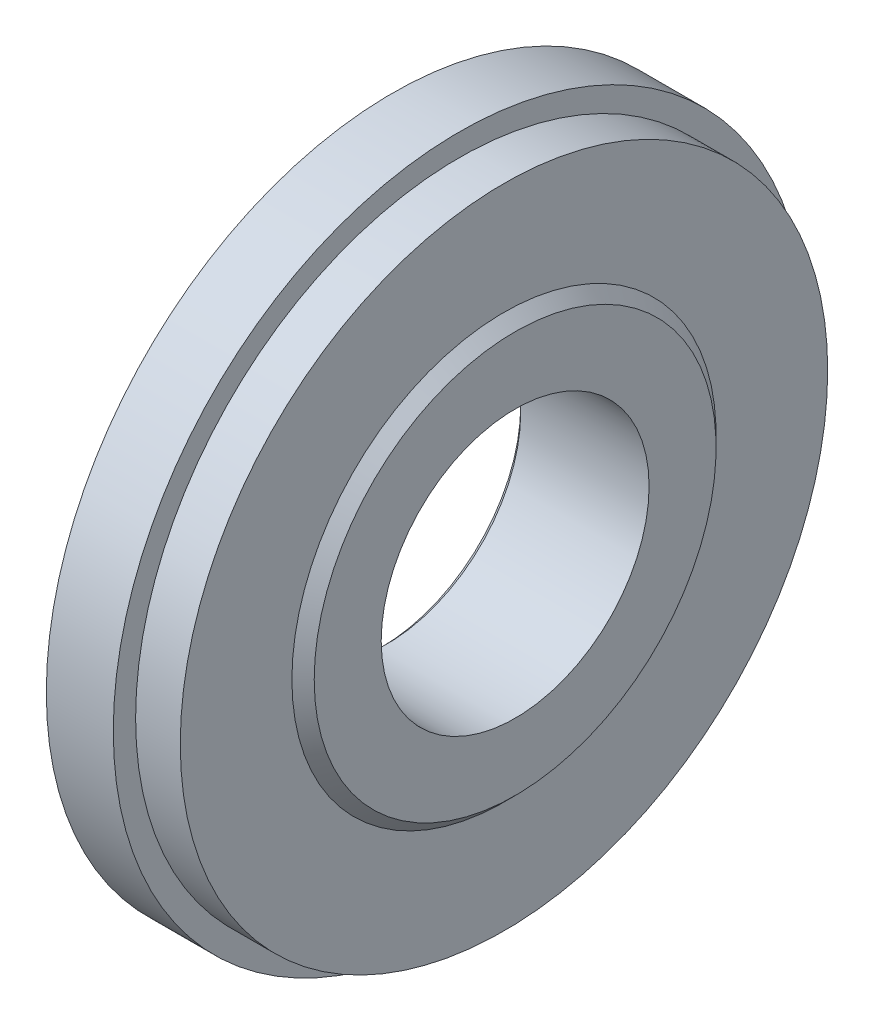
ISO-10303-21;
HEADER;
FILE_DESCRIPTION(('STEP AP214'),'2;1');
FILE_NAME('part.step','',(''),(''),'','','');
FILE_SCHEMA(('AUTOMOTIVE_DESIGN { 1 0 10303 214 1 1 1 1 }'));
ENDSEC;
DATA;
#1=APPLICATION_CONTEXT('core data for automotive mechanical design processes');
#2=APPLICATION_PROTOCOL_DEFINITION('international standard','automotive_design',2000,#1);
#3=PRODUCT_CONTEXT('',#1,'mechanical');
#4=PRODUCT('Part','Part','',(#3));
#5=PRODUCT_RELATED_PRODUCT_CATEGORY('part','',(#4));
#6=PRODUCT_DEFINITION_FORMATION('','',#4);
#7=PRODUCT_DEFINITION_CONTEXT('part definition',#1,'design');
#8=PRODUCT_DEFINITION('design','',#6,#7);
#9=PRODUCT_DEFINITION_SHAPE('','',#8);
#10=(LENGTH_UNIT() NAMED_UNIT(*) SI_UNIT(.MILLI.,.METRE.));
#11=(NAMED_UNIT(*) PLANE_ANGLE_UNIT() SI_UNIT($,.RADIAN.));
#12=(NAMED_UNIT(*) SI_UNIT($,.STERADIAN.) SOLID_ANGLE_UNIT());
#13=UNCERTAINTY_MEASURE_WITH_UNIT(LENGTH_MEASURE(1.E-05),#10,'distance_accuracy_value','');
#14=(GEOMETRIC_REPRESENTATION_CONTEXT(3) GLOBAL_UNCERTAINTY_ASSIGNED_CONTEXT((#13)) GLOBAL_UNIT_ASSIGNED_CONTEXT((#10,
#11,#12)) REPRESENTATION_CONTEXT('',''));
#15=CARTESIAN_POINT('',(0.,0.,0.));
#16=DIRECTION('',(0.,0.,1.));
#17=DIRECTION('',(1.,0.,0.));
#18=AXIS2_PLACEMENT_3D('',#15,#16,#17);
#19=CARTESIAN_POINT('',(-8.00000000000001,0.,0.));
#20=DIRECTION('',(-1.,0.,0.));
#21=DIRECTION('',(0.,0.,1.));
#22=AXIS2_PLACEMENT_3D('',#19,#20,#21);
#23=CYLINDRICAL_SURFACE('',#22,16.);
#24=CARTESIAN_POINT('',(0.500000000000004,0.,0.));
#25=DIRECTION('',(-1.,0.,0.));
#26=DIRECTION('',(0.,0.,1.));
#27=AXIS2_PLACEMENT_3D('',#24,#25,#26);
#28=CIRCLE('',#27,16.);
#29=CARTESIAN_POINT('',(0.500000000000004,0.,16.));
#30=VERTEX_POINT('',#29);
#31=EDGE_CURVE('E10',#30,#30,#28,.F.);
#32=ORIENTED_EDGE('',*,*,#31,.T.);
#33=EDGE_LOOP('',(#32));
#34=FACE_BOUND('',#33,.T.);
#35=CARTESIAN_POINT('',(5.00000000000001,0.,0.));
#36=DIRECTION('',(-1.,0.,0.));
#37=DIRECTION('',(0.,0.,1.));
#38=AXIS2_PLACEMENT_3D('',#35,#36,#37);
#39=CIRCLE('',#38,16.);
#40=CARTESIAN_POINT('',(5.00000000000001,0.,16.));
#41=VERTEX_POINT('',#40);
#42=EDGE_CURVE('E51',#41,#41,#39,.T.);
#43=ORIENTED_EDGE('',*,*,#42,.T.);
#44=EDGE_LOOP('',(#43));
#45=FACE_BOUND('',#44,.T.);
#46=ADVANCED_FACE('F32',(#34,#45),#23,.T.);
#47=CARTESIAN_POINT('',(5.00000000000001,0.,0.));
#48=DIRECTION('',(-1.,0.,0.));
#49=DIRECTION('',(0.,0.,1.));
#50=AXIS2_PLACEMENT_3D('',#47,#48,#49);
#51=TOROIDAL_SURFACE('',#50,18.,2.);
#52=ORIENTED_EDGE('',*,*,#42,.F.);
#53=EDGE_LOOP('',(#52));
#54=FACE_BOUND('',#53,.T.);
#55=CARTESIAN_POINT('',(7.00000000000001,0.,0.));
#56=DIRECTION('',(-1.,0.,0.));
#57=DIRECTION('',(0.,0.,1.));
#58=AXIS2_PLACEMENT_3D('',#55,#56,#57);
#59=CIRCLE('',#58,18.);
#60=CARTESIAN_POINT('',(7.00000000000001,0.,18.));
#61=VERTEX_POINT('',#60);
#62=EDGE_CURVE('E54',#61,#61,#59,.T.);
#63=ORIENTED_EDGE('',*,*,#62,.T.);
#64=EDGE_LOOP('',(#63));
#65=FACE_BOUND('',#64,.T.);
#66=ADVANCED_FACE('F105',(#54,#65),#51,.F.);
#67=CARTESIAN_POINT('',(7.00000000000001,18.,0.));
#68=DIRECTION('',(-1.,0.,0.));
#69=DIRECTION('',(0.,0.,1.));
#70=AXIS2_PLACEMENT_3D('',#67,#68,#69);
#71=PLANE('',#70);
#72=CARTESIAN_POINT('',(7.00000000000001,0.,0.));
#73=DIRECTION('',(-1.,0.,0.));
#74=DIRECTION('',(0.,0.,1.));
#75=AXIS2_PLACEMENT_3D('',#72,#73,#74);
#76=CIRCLE('',#75,26.);
#77=CARTESIAN_POINT('',(7.00000000000001,0.,26.));
#78=VERTEX_POINT('',#77);
#79=EDGE_CURVE('E57',#78,#78,#76,.T.);
#80=ORIENTED_EDGE('',*,*,#79,.T.);
#81=EDGE_LOOP('',(#80));
#82=FACE_BOUND('',#81,.T.);
#83=ORIENTED_EDGE('',*,*,#62,.F.);
#84=EDGE_LOOP('',(#83));
#85=FACE_BOUND('',#84,.T.);
#86=ADVANCED_FACE('F109',(#82,#85),#71,.T.);
#87=CARTESIAN_POINT('',(5.00000000000001,0.,0.));
#88=DIRECTION('',(-1.,0.,0.));
#89=DIRECTION('',(0.,0.,1.));
#90=AXIS2_PLACEMENT_3D('',#87,#88,#89);
#91=TOROIDAL_SURFACE('',#90,26.,2.);
#92=ORIENTED_EDGE('',*,*,#79,.F.);
#93=EDGE_LOOP('',(#92));
#94=FACE_BOUND('',#93,.T.);
#95=CARTESIAN_POINT('',(5.00000000000001,0.,0.));
#96=DIRECTION('',(-1.,0.,0.));
#97=DIRECTION('',(0.,0.,1.));
#98=AXIS2_PLACEMENT_3D('',#95,#96,#97);
#99=CIRCLE('',#98,28.);
#100=CARTESIAN_POINT('',(5.00000000000001,0.,28.));
#101=VERTEX_POINT('',#100);
#102=EDGE_CURVE('E60',#101,#101,#99,.T.);
#103=ORIENTED_EDGE('',*,*,#102,.T.);
#104=EDGE_LOOP('',(#103));
#105=FACE_BOUND('',#104,.T.);
#106=ADVANCED_FACE('F117',(#94,#105),#91,.F.);
#107=CARTESIAN_POINT('',(-8.00000000000001,0.,0.));
#108=DIRECTION('',(-1.,0.,0.));
#109=DIRECTION('',(0.,0.,1.));
#110=AXIS2_PLACEMENT_3D('',#107,#108,#109);
#111=CYLINDRICAL_SURFACE('',#110,28.);
#112=CARTESIAN_POINT('',(1.,0.,0.));
#113=DIRECTION('',(-1.,0.,0.));
#114=DIRECTION('',(0.,0.,1.));
#115=AXIS2_PLACEMENT_3D('',#112,#113,#114);
#116=CIRCLE('',#115,28.);
#117=CARTESIAN_POINT('',(1.,0.,28.));
#118=VERTEX_POINT('',#117);
#119=EDGE_CURVE('E63',#118,#118,#116,.T.);
#120=ORIENTED_EDGE('',*,*,#119,.T.);
#121=EDGE_LOOP('',(#120));
#122=FACE_BOUND('',#121,.T.);
#123=ORIENTED_EDGE('',*,*,#102,.F.);
#124=EDGE_LOOP('',(#123));
#125=FACE_BOUND('',#124,.T.);
#126=ADVANCED_FACE('F123',(#122,#125),#111,.F.);
#127=CARTESIAN_POINT('',(1.,28.,0.));
#128=DIRECTION('',(-1.,0.,0.));
#129=DIRECTION('',(0.,0.,1.));
#130=AXIS2_PLACEMENT_3D('',#127,#128,#129);
#131=PLANE('',#130);
#132=CARTESIAN_POINT('',(1.,0.,0.));
#133=DIRECTION('',(-1.,0.,0.));
#134=DIRECTION('',(0.,0.,1.));
#135=AXIS2_PLACEMENT_3D('',#132,#133,#134);
#136=CIRCLE('',#135,31.);
#137=CARTESIAN_POINT('',(1.,0.,31.));
#138=VERTEX_POINT('',#137);
#139=EDGE_CURVE('E66',#138,#138,#136,.T.);
#140=ORIENTED_EDGE('',*,*,#139,.T.);
#141=EDGE_LOOP('',(#140));
#142=FACE_BOUND('',#141,.T.);
#143=ORIENTED_EDGE('',*,*,#119,.F.);
#144=EDGE_LOOP('',(#143));
#145=FACE_BOUND('',#144,.T.);
#146=ADVANCED_FACE('F129',(#142,#145),#131,.T.);
#147=CARTESIAN_POINT('',(-8.00000000000001,0.,0.));
#148=DIRECTION('',(-1.,0.,0.));
#149=DIRECTION('',(0.,0.,1.));
#150=AXIS2_PLACEMENT_3D('',#147,#148,#149);
#151=CYLINDRICAL_SURFACE('',#150,31.);
#152=CARTESIAN_POINT('',(7.,0.,0.));
#153=DIRECTION('',(-1.,0.,0.));
#154=DIRECTION('',(0.,0.,1.));
#155=AXIS2_PLACEMENT_3D('',#152,#153,#154);
#156=CIRCLE('',#155,31.);
#157=CARTESIAN_POINT('',(7.,0.,31.));
#158=VERTEX_POINT('',#157);
#159=EDGE_CURVE('E69',#158,#158,#156,.T.);
#160=ORIENTED_EDGE('',*,*,#159,.T.);
#161=EDGE_LOOP('',(#160));
#162=FACE_BOUND('',#161,.T.);
#163=ORIENTED_EDGE('',*,*,#139,.F.);
#164=EDGE_LOOP('',(#163));
#165=FACE_BOUND('',#164,.T.);
#166=ADVANCED_FACE('F133',(#162,#165),#151,.T.);
#167=CARTESIAN_POINT('',(7.,31.,0.));
#168=DIRECTION('',(1.,0.,0.));
#169=DIRECTION('',(0.,0.,-1.));
#170=AXIS2_PLACEMENT_3D('',#167,#168,#169);
#171=PLANE('',#170);
#172=CARTESIAN_POINT('',(7.,0.,0.));
#173=DIRECTION('',(-1.,0.,0.));
#174=DIRECTION('',(0.,0.,1.));
#175=AXIS2_PLACEMENT_3D('',#172,#173,#174);
#176=CIRCLE('',#175,29.);
#177=CARTESIAN_POINT('',(7.,0.,29.));
#178=VERTEX_POINT('',#177);
#179=EDGE_CURVE('E72',#178,#178,#176,.T.);
#180=ORIENTED_EDGE('',*,*,#179,.T.);
#181=EDGE_LOOP('',(#180));
#182=FACE_BOUND('',#181,.T.);
#183=ORIENTED_EDGE('',*,*,#159,.F.);
#184=EDGE_LOOP('',(#183));
#185=FACE_BOUND('',#184,.T.);
#186=ADVANCED_FACE('F137',(#182,#185),#171,.T.);
#187=CARTESIAN_POINT('',(-8.00000000000001,0.,0.));
#188=DIRECTION('',(-1.,0.,0.));
#189=DIRECTION('',(0.,0.,1.));
#190=AXIS2_PLACEMENT_3D('',#187,#188,#189);
#191=CYLINDRICAL_SURFACE('',#190,29.);
#192=CARTESIAN_POINT('',(11.,0.,0.));
#193=DIRECTION('',(-1.,0.,0.));
#194=DIRECTION('',(0.,0.,1.));
#195=AXIS2_PLACEMENT_3D('',#192,#193,#194);
#196=CIRCLE('',#195,29.);
#197=CARTESIAN_POINT('',(11.,0.,29.));
#198=VERTEX_POINT('',#197);
#199=EDGE_CURVE('E75',#198,#198,#196,.T.);
#200=ORIENTED_EDGE('',*,*,#199,.T.);
#201=EDGE_LOOP('',(#200));
#202=FACE_BOUND('',#201,.T.);
#203=ORIENTED_EDGE('',*,*,#179,.F.);
#204=EDGE_LOOP('',(#203));
#205=FACE_BOUND('',#204,.T.);
#206=ADVANCED_FACE('F141',(#202,#205),#191,.T.);
#207=CARTESIAN_POINT('',(11.,29.,0.));
#208=DIRECTION('',(1.,0.,0.));
#209=DIRECTION('',(0.,0.,-1.));
#210=AXIS2_PLACEMENT_3D('',#207,#208,#209);
#211=PLANE('',#210);
#212=CARTESIAN_POINT('',(11.,0.,0.));
#213=DIRECTION('',(-1.,0.,0.));
#214=DIRECTION('',(0.,0.,1.));
#215=AXIS2_PLACEMENT_3D('',#212,#213,#214);
#216=CIRCLE('',#215,19.0000000000001);
#217=CARTESIAN_POINT('',(11.,0.,19.0000000000001));
#218=VERTEX_POINT('',#217);
#219=EDGE_CURVE('E78',#218,#218,#216,.T.);
#220=ORIENTED_EDGE('',*,*,#219,.T.);
#221=EDGE_LOOP('',(#220));
#222=FACE_BOUND('',#221,.T.);
#223=ORIENTED_EDGE('',*,*,#199,.F.);
#224=EDGE_LOOP('',(#223));
#225=FACE_BOUND('',#224,.T.);
#226=ADVANCED_FACE('F145',(#222,#225),#211,.T.);
#227=CARTESIAN_POINT('',(11.,0.,0.));
#228=DIRECTION('',(-1.,0.,0.));
#229=DIRECTION('',(0.,0.,1.));
#230=AXIS2_PLACEMENT_3D('',#227,#228,#229);
#231=CONICAL_SURFACE('',#230,19.0000000000001,0.785398163397488);
#232=CARTESIAN_POINT('',(12.,0.,0.));
#233=DIRECTION('',(-1.,0.,0.));
#234=DIRECTION('',(0.,0.,1.));
#235=AXIS2_PLACEMENT_3D('',#232,#233,#234);
#236=CIRCLE('',#235,18.0000000000001);
#237=CARTESIAN_POINT('',(12.,0.,18.0000000000001));
#238=VERTEX_POINT('',#237);
#239=EDGE_CURVE('E81',#238,#238,#236,.T.);
#240=ORIENTED_EDGE('',*,*,#239,.T.);
#241=EDGE_LOOP('',(#240));
#242=FACE_BOUND('',#241,.T.);
#243=ORIENTED_EDGE('',*,*,#219,.F.);
#244=EDGE_LOOP('',(#243));
#245=FACE_BOUND('',#244,.T.);
#246=ADVANCED_FACE('F102',(#242,#245),#231,.T.);
#247=CARTESIAN_POINT('',(12.,18.0000000000001,0.));
#248=DIRECTION('',(1.,0.,0.));
#249=DIRECTION('',(0.,0.,-1.));
#250=AXIS2_PLACEMENT_3D('',#247,#248,#249);
#251=PLANE('',#250);
#252=CARTESIAN_POINT('',(12.,0.,0.));
#253=DIRECTION('',(-1.,0.,0.));
#254=DIRECTION('',(0.,0.,1.));
#255=AXIS2_PLACEMENT_3D('',#252,#253,#254);
#256=CIRCLE('',#255,12.);
#257=CARTESIAN_POINT('',(12.,0.,12.));
#258=VERTEX_POINT('',#257);
#259=EDGE_CURVE('E84',#258,#258,#256,.T.);
#260=ORIENTED_EDGE('',*,*,#259,.T.);
#261=EDGE_LOOP('',(#260));
#262=FACE_BOUND('',#261,.T.);
#263=ORIENTED_EDGE('',*,*,#239,.F.);
#264=EDGE_LOOP('',(#263));
#265=FACE_BOUND('',#264,.T.);
#266=ADVANCED_FACE('F88',(#262,#265),#251,.T.);
#267=CARTESIAN_POINT('',(-8.00000000000001,0.,0.));
#268=DIRECTION('',(-1.,0.,0.));
#269=DIRECTION('',(0.,0.,1.));
#270=AXIS2_PLACEMENT_3D('',#267,#268,#269);
#271=CYLINDRICAL_SURFACE('',#270,12.);
#272=CARTESIAN_POINT('',(0.500000000000009,0.,0.));
#273=DIRECTION('',(-1.,0.,0.));
#274=DIRECTION('',(0.,0.,1.));
#275=AXIS2_PLACEMENT_3D('',#272,#273,#274);
#276=CIRCLE('',#275,12.);
#277=CARTESIAN_POINT('',(0.500000000000009,0.,12.));
#278=VERTEX_POINT('',#277);
#279=EDGE_CURVE('E46',#278,#278,#276,.T.);
#280=ORIENTED_EDGE('',*,*,#279,.T.);
#281=EDGE_LOOP('',(#280));
#282=FACE_BOUND('',#281,.T.);
#283=ORIENTED_EDGE('',*,*,#259,.F.);
#284=EDGE_LOOP('',(#283));
#285=FACE_BOUND('',#284,.T.);
#286=ADVANCED_FACE('F91',(#282,#285),#271,.F.);
#287=CARTESIAN_POINT('',(0.,12.,0.));
#288=DIRECTION('',(-1.,0.,0.));
#289=DIRECTION('',(0.,0.,1.));
#290=AXIS2_PLACEMENT_3D('',#287,#288,#289);
#291=PLANE('',#290);
#292=CARTESIAN_POINT('',(0.,0.,0.));
#293=DIRECTION('',(-1.,0.,0.));
#294=DIRECTION('',(0.,0.,1.));
#295=AXIS2_PLACEMENT_3D('',#292,#293,#294);
#296=CIRCLE('',#295,12.5);
#297=CARTESIAN_POINT('',(0.,0.,12.5));
#298=VERTEX_POINT('',#297);
#299=EDGE_CURVE('E38',#298,#298,#296,.F.);
#300=ORIENTED_EDGE('',*,*,#299,.T.);
#301=EDGE_LOOP('',(#300));
#302=FACE_BOUND('',#301,.T.);
#303=CARTESIAN_POINT('',(0.,0.,0.));
#304=DIRECTION('',(-1.,0.,0.));
#305=DIRECTION('',(0.,0.,1.));
#306=AXIS2_PLACEMENT_3D('',#303,#304,#305);
#307=CIRCLE('',#306,15.5);
#308=CARTESIAN_POINT('',(0.,0.,15.5));
#309=VERTEX_POINT('',#308);
#310=EDGE_CURVE('E42',#309,#309,#307,.T.);
#311=ORIENTED_EDGE('',*,*,#310,.T.);
#312=EDGE_LOOP('',(#311));
#313=FACE_BOUND('',#312,.T.);
#314=ADVANCED_FACE('F93',(#302,#313),#291,.T.);
#315=CARTESIAN_POINT('',(0.500000000000009,0.,0.));
#316=DIRECTION('',(-1.,0.,0.));
#317=DIRECTION('',(0.,0.,1.));
#318=AXIS2_PLACEMENT_3D('',#315,#316,#317);
#319=CONICAL_SURFACE('',#318,12.,0.785398163397443);
#320=ORIENTED_EDGE('',*,*,#299,.F.);
#321=EDGE_LOOP('',(#320));
#322=FACE_BOUND('',#321,.T.);
#323=ORIENTED_EDGE('',*,*,#279,.F.);
#324=EDGE_LOOP('',(#323));
#325=FACE_BOUND('',#324,.T.);
#326=ADVANCED_FACE('F100',(#322,#325),#319,.F.);
#327=CARTESIAN_POINT('',(0.,0.,0.));
#328=DIRECTION('',(1.,0.,0.));
#329=DIRECTION('',(0.,0.,-1.));
#330=AXIS2_PLACEMENT_3D('',#327,#328,#329);
#331=CONICAL_SURFACE('',#330,15.5,0.785398163397453);
#332=ORIENTED_EDGE('',*,*,#31,.F.);
#333=EDGE_LOOP('',(#332));
#334=FACE_BOUND('',#333,.T.);
#335=ORIENTED_EDGE('',*,*,#310,.F.);
#336=EDGE_LOOP('',(#335));
#337=FACE_BOUND('',#336,.T.);
#338=ADVANCED_FACE('F193',(#334,#337),#331,.T.);
#339=CLOSED_SHELL('',(#46,#66,#86,#106,#126,#146,#166,#186,#206,#226,#246,#266,#286,#314,#326,#338));
#340=MANIFOLD_SOLID_BREP('B2',#339);
#341=ADVANCED_BREP_SHAPE_REPRESENTATION('',(#18,#340),#14);
#342=SHAPE_DEFINITION_REPRESENTATION(#9,#341);
ENDSEC;
END-ISO-10303-21;
